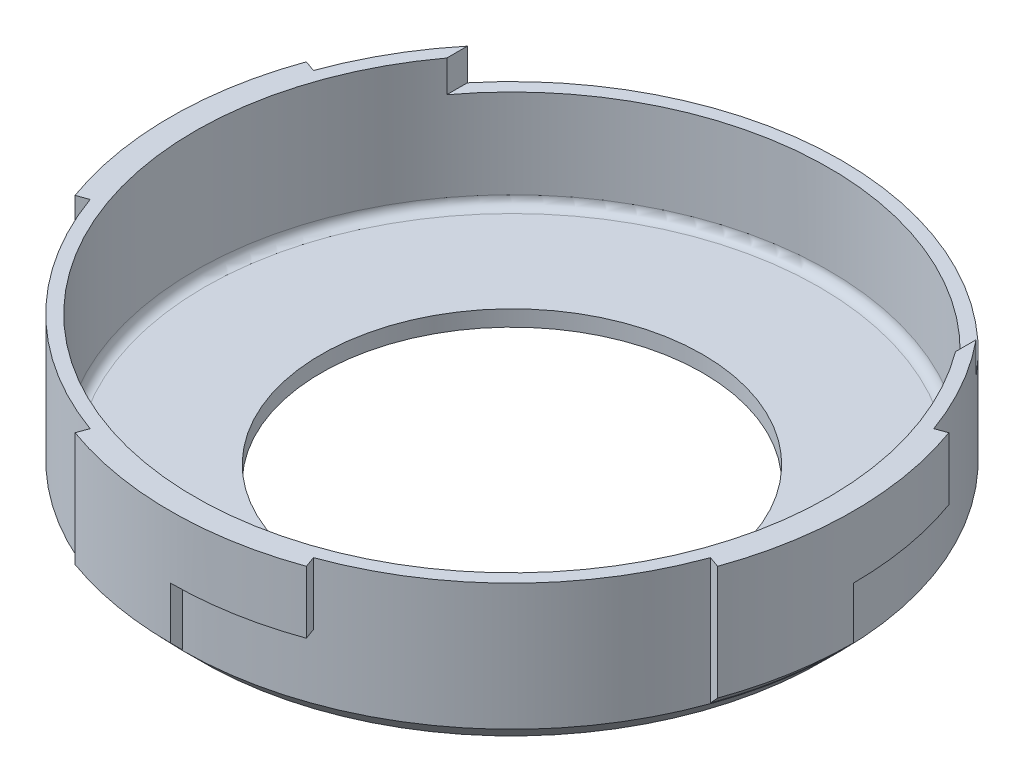
ISO-10303-21;
HEADER;
FILE_DESCRIPTION(('STEP AP214'),'2;1');
FILE_NAME('part.step','',(''),(''),'','','');
FILE_SCHEMA(('AUTOMOTIVE_DESIGN { 1 0 10303 214 1 1 1 1 }'));
ENDSEC;
DATA;
#1=APPLICATION_CONTEXT('core data for automotive mechanical design processes');
#2=APPLICATION_PROTOCOL_DEFINITION('international standard','automotive_design',2000,#1);
#3=PRODUCT_CONTEXT('',#1,'mechanical');
#4=PRODUCT('Part','Part','',(#3));
#5=PRODUCT_RELATED_PRODUCT_CATEGORY('part','',(#4));
#6=PRODUCT_DEFINITION_FORMATION('','',#4);
#7=PRODUCT_DEFINITION_CONTEXT('part definition',#1,'design');
#8=PRODUCT_DEFINITION('design','',#6,#7);
#9=PRODUCT_DEFINITION_SHAPE('','',#8);
#10=(LENGTH_UNIT() NAMED_UNIT(*) SI_UNIT(.MILLI.,.METRE.));
#11=(NAMED_UNIT(*) PLANE_ANGLE_UNIT() SI_UNIT($,.RADIAN.));
#12=(NAMED_UNIT(*) SI_UNIT($,.STERADIAN.) SOLID_ANGLE_UNIT());
#13=UNCERTAINTY_MEASURE_WITH_UNIT(LENGTH_MEASURE(1.E-05),#10,'distance_accuracy_value','');
#14=(GEOMETRIC_REPRESENTATION_CONTEXT(3) GLOBAL_UNCERTAINTY_ASSIGNED_CONTEXT((#13)) GLOBAL_UNIT_ASSIGNED_CONTEXT((#10,
#11,#12)) REPRESENTATION_CONTEXT('',''));
#15=CARTESIAN_POINT('',(0.,0.,0.));
#16=DIRECTION('',(0.,0.,1.));
#17=DIRECTION('',(1.,0.,0.));
#18=AXIS2_PLACEMENT_3D('',#15,#16,#17);
#19=CARTESIAN_POINT('',(0.,2.5,0.));
#20=DIRECTION('',(0.,-1.,0.));
#21=DIRECTION('',(0.,0.,-1.));
#22=AXIS2_PLACEMENT_3D('',#19,#20,#21);
#23=CYLINDRICAL_SURFACE('',#22,30.);
#24=CARTESIAN_POINT('',(0.,-0.5,0.));
#25=DIRECTION('',(0.,-1.,0.));
#26=DIRECTION('',(0.,0.,-1.));
#27=AXIS2_PLACEMENT_3D('',#24,#25,#26);
#28=CIRCLE('',#27,30.);
#29=CARTESIAN_POINT('',(0.,-0.5,-30.));
#30=VERTEX_POINT('',#29);
#31=EDGE_CURVE('E202',#30,#30,#28,.T.);
#32=ORIENTED_EDGE('',*,*,#31,.T.);
#33=EDGE_LOOP('',(#32));
#34=FACE_BOUND('',#33,.T.);
#35=CARTESIAN_POINT('',(0.,2.,0.));
#36=DIRECTION('',(0.,1.,0.));
#37=DIRECTION('',(0.,0.,1.));
#38=AXIS2_PLACEMENT_3D('',#35,#36,#37);
#39=CIRCLE('',#38,30.);
#40=CARTESIAN_POINT('',(0.,2.,30.));
#41=VERTEX_POINT('',#40);
#42=EDGE_CURVE('E349',#41,#41,#39,.T.);
#43=ORIENTED_EDGE('',*,*,#42,.T.);
#44=EDGE_LOOP('',(#43));
#45=FACE_BOUND('',#44,.T.);
#46=ADVANCED_FACE('F41',(#34,#45),#23,.F.);
#47=CARTESIAN_POINT('',(0.,2.5,0.));
#48=DIRECTION('',(0.,-1.,0.));
#49=DIRECTION('',(0.,0.,-1.));
#50=AXIS2_PLACEMENT_3D('',#47,#48,#49);
#51=CYLINDRICAL_SURFACE('',#50,51.85);
#52=CARTESIAN_POINT('',(0.,2.60000000000001,0.));
#53=DIRECTION('',(0.,-1.,0.));
#54=DIRECTION('',(0.,0.,-1.));
#55=AXIS2_PLACEMENT_3D('',#52,#53,#54);
#56=CIRCLE('',#55,51.85);
#57=CARTESIAN_POINT('',(0.,2.60000000000001,-51.85));
#58=VERTEX_POINT('',#57);
#59=EDGE_CURVE('E448',#58,#58,#56,.F.);
#60=ORIENTED_EDGE('',*,*,#59,.T.);
#61=EDGE_LOOP('',(#60));
#62=FACE_BOUND('',#61,.T.);
#63=CARTESIAN_POINT('',(0.,17.5,0.));
#64=DIRECTION('',(0.,-1.,0.));
#65=DIRECTION('',(0.,0.,-1.));
#66=AXIS2_PLACEMENT_3D('',#63,#64,#65);
#67=CIRCLE('',#66,51.85);
#68=CARTESIAN_POINT('',(-40.,17.5,-32.9912488396545));
#69=VERTEX_POINT('',#68);
#70=CARTESIAN_POINT('',(40.,17.5,-32.9912488396544));
#71=VERTEX_POINT('',#70);
#72=EDGE_CURVE('E210',#69,#71,#67,.T.);
#73=ORIENTED_EDGE('',*,*,#72,.T.);
#74=DIRECTION('',(0.,-1.,0.));
#75=VECTOR('',#74,1.);
#76=CARTESIAN_POINT('',(40.,2.49999999999994,-32.9912488396545));
#77=LINE('',#76,#75);
#78=CARTESIAN_POINT('',(40.,22.5,-32.9912488396544));
#79=VERTEX_POINT('',#78);
#80=EDGE_CURVE('E193',#71,#79,#77,.F.);
#81=ORIENTED_EDGE('',*,*,#80,.T.);
#82=CARTESIAN_POINT('',(0.,22.5,0.));
#83=DIRECTION('',(0.,1.,0.));
#84=DIRECTION('',(0.,0.,1.));
#85=AXIS2_PLACEMENT_3D('',#82,#83,#84);
#86=CIRCLE('',#85,51.85);
#87=CARTESIAN_POINT('',(48.7846678702766,22.5,-17.5635611647184));
#88=VERTEX_POINT('',#87);
#89=EDGE_CURVE('E208',#88,#79,#86,.T.);
#90=ORIENTED_EDGE('',*,*,#89,.F.);
#91=DIRECTION('',(0.,-1.,0.));
#92=VECTOR('',#91,1.);
#93=CARTESIAN_POINT('',(48.7846678702766,22.5,-17.5635611647184));
#94=LINE('',#93,#92);
#95=CARTESIAN_POINT('',(48.7846678702766,12.7,-17.5635611647184));
#96=VERTEX_POINT('',#95);
#97=EDGE_CURVE('E257',#88,#96,#94,.T.);
#98=ORIENTED_EDGE('',*,*,#97,.T.);
#99=CARTESIAN_POINT('',(0.,12.7,0.));
#100=DIRECTION('',(0.,-1.,0.));
#101=DIRECTION('',(0.,0.,-1.));
#102=AXIS2_PLACEMENT_3D('',#99,#100,#101);
#103=CIRCLE('',#102,51.85);
#104=CARTESIAN_POINT('',(51.85,12.7,0.));
#105=VERTEX_POINT('',#104);
#106=EDGE_CURVE('E251',#96,#105,#103,.T.);
#107=ORIENTED_EDGE('',*,*,#106,.T.);
#108=DIRECTION('',(0.,-1.,0.));
#109=VECTOR('',#108,1.);
#110=CARTESIAN_POINT('',(51.85,22.5,0.));
#111=LINE('',#110,#109);
#112=CARTESIAN_POINT('',(51.85,2.7,0.));
#113=VERTEX_POINT('',#112);
#114=EDGE_CURVE('E245',#105,#113,#111,.T.);
#115=ORIENTED_EDGE('',*,*,#114,.T.);
#116=CARTESIAN_POINT('',(0.,2.7,0.));
#117=DIRECTION('',(0.,1.,0.));
#118=DIRECTION('',(0.,0.,1.));
#119=AXIS2_PLACEMENT_3D('',#116,#117,#118);
#120=CIRCLE('',#119,51.85);
#121=CARTESIAN_POINT('',(48.7846678702766,2.7,17.5635611647184));
#122=VERTEX_POINT('',#121);
#123=EDGE_CURVE('E229',#122,#113,#120,.T.);
#124=ORIENTED_EDGE('',*,*,#123,.F.);
#125=DIRECTION('',(0.,-1.,0.));
#126=VECTOR('',#125,1.);
#127=CARTESIAN_POINT('',(48.7846678702766,22.5,17.5635611647184));
#128=LINE('',#127,#126);
#129=CARTESIAN_POINT('',(48.7846678702766,22.5,17.5635611647184));
#130=VERTEX_POINT('',#129);
#131=EDGE_CURVE('E241',#130,#122,#128,.T.);
#132=ORIENTED_EDGE('',*,*,#131,.F.);
#133=CARTESIAN_POINT('',(17.5635611647182,22.5,48.7846678702766));
#134=VERTEX_POINT('',#133);
#135=EDGE_CURVE('E220',#134,#130,#86,.T.);
#136=ORIENTED_EDGE('',*,*,#135,.F.);
#137=DIRECTION('',(0.,-1.,0.));
#138=VECTOR('',#137,1.);
#139=CARTESIAN_POINT('',(17.5635611647182,22.5,48.7846678702766));
#140=LINE('',#139,#138);
#141=CARTESIAN_POINT('',(17.5635611647182,12.7,48.7846678702766));
#142=VERTEX_POINT('',#141);
#143=EDGE_CURVE('E308',#134,#142,#140,.T.);
#144=ORIENTED_EDGE('',*,*,#143,.T.);
#145=CARTESIAN_POINT('',(0.,12.7,0.));
#146=DIRECTION('',(0.,-1.,0.));
#147=DIRECTION('',(1.,0.,0.));
#148=AXIS2_PLACEMENT_3D('',#145,#146,#147);
#149=CIRCLE('',#148,51.85);
#150=CARTESIAN_POINT('',(-1.81033307419016E-13,12.7,51.85));
#151=VERTEX_POINT('',#150);
#152=EDGE_CURVE('E302',#142,#151,#149,.T.);
#153=ORIENTED_EDGE('',*,*,#152,.T.);
#154=DIRECTION('',(0.,-1.,0.));
#155=VECTOR('',#154,1.);
#156=CARTESIAN_POINT('',(-1.81033307419016E-13,22.5,51.85));
#157=LINE('',#156,#155);
#158=CARTESIAN_POINT('',(-1.81033307419016E-13,2.7,51.85));
#159=VERTEX_POINT('',#158);
#160=EDGE_CURVE('E280',#151,#159,#157,.T.);
#161=ORIENTED_EDGE('',*,*,#160,.T.);
#162=CARTESIAN_POINT('',(0.,2.7,0.));
#163=DIRECTION('',(0.,1.,0.));
#164=DIRECTION('',(-1.,0.,0.));
#165=AXIS2_PLACEMENT_3D('',#162,#163,#164);
#166=CIRCLE('',#165,51.85);
#167=CARTESIAN_POINT('',(-17.5635611647186,2.7,48.7846678702765));
#168=VERTEX_POINT('',#167);
#169=EDGE_CURVE('E266',#168,#159,#166,.T.);
#170=ORIENTED_EDGE('',*,*,#169,.F.);
#171=DIRECTION('',(0.,-1.,0.));
#172=VECTOR('',#171,1.);
#173=CARTESIAN_POINT('',(-17.5635611647186,22.5,48.7846678702765));
#174=LINE('',#173,#172);
#175=CARTESIAN_POINT('',(-17.5635611647186,22.5,48.7846678702765));
#176=VERTEX_POINT('',#175);
#177=EDGE_CURVE('E276',#176,#168,#174,.T.);
#178=ORIENTED_EDGE('',*,*,#177,.F.);
#179=CARTESIAN_POINT('',(-48.7846678702766,22.5,17.5635611647184));
#180=VERTEX_POINT('',#179);
#181=EDGE_CURVE('E223',#180,#176,#86,.T.);
#182=ORIENTED_EDGE('',*,*,#181,.F.);
#183=DIRECTION('',(0.,-1.,0.));
#184=VECTOR('',#183,1.);
#185=CARTESIAN_POINT('',(-48.7846678702766,22.5,17.5635611647184));
#186=LINE('',#185,#184);
#187=CARTESIAN_POINT('',(-48.7846678702766,12.7,17.5635611647184));
#188=VERTEX_POINT('',#187);
#189=EDGE_CURVE('E328',#180,#188,#186,.T.);
#190=ORIENTED_EDGE('',*,*,#189,.T.);
#191=CARTESIAN_POINT('',(0.,12.7,0.));
#192=DIRECTION('',(0.,-1.,0.));
#193=DIRECTION('',(0.,0.,1.));
#194=AXIS2_PLACEMENT_3D('',#191,#192,#193);
#195=CIRCLE('',#194,51.85);
#196=CARTESIAN_POINT('',(-51.85,12.7,0.));
#197=VERTEX_POINT('',#196);
#198=EDGE_CURVE('E322',#188,#197,#195,.T.);
#199=ORIENTED_EDGE('',*,*,#198,.T.);
#200=DIRECTION('',(0.,-1.,0.));
#201=VECTOR('',#200,1.);
#202=CARTESIAN_POINT('',(-51.85,22.5,0.));
#203=LINE('',#202,#201);
#204=CARTESIAN_POINT('',(-51.85,2.7,0.));
#205=VERTEX_POINT('',#204);
#206=EDGE_CURVE('E296',#197,#205,#203,.T.);
#207=ORIENTED_EDGE('',*,*,#206,.T.);
#208=CARTESIAN_POINT('',(0.,2.7,0.));
#209=DIRECTION('',(0.,1.,0.));
#210=DIRECTION('',(0.,0.,-1.));
#211=AXIS2_PLACEMENT_3D('',#208,#209,#210);
#212=CIRCLE('',#211,51.85);
#213=CARTESIAN_POINT('',(-48.7846678702766,2.7,-17.5635611647184));
#214=VERTEX_POINT('',#213);
#215=EDGE_CURVE('E283',#214,#205,#212,.T.);
#216=ORIENTED_EDGE('',*,*,#215,.F.);
#217=DIRECTION('',(0.,-1.,0.));
#218=VECTOR('',#217,1.);
#219=CARTESIAN_POINT('',(-48.7846678702766,22.5,-17.5635611647184));
#220=LINE('',#219,#218);
#221=CARTESIAN_POINT('',(-48.7846678702766,22.5,-17.5635611647184));
#222=VERTEX_POINT('',#221);
#223=EDGE_CURVE('E292',#222,#214,#220,.T.);
#224=ORIENTED_EDGE('',*,*,#223,.F.);
#225=CARTESIAN_POINT('',(-40.,22.5,-32.9912488396544));
#226=VERTEX_POINT('',#225);
#227=EDGE_CURVE('E218',#226,#222,#86,.T.);
#228=ORIENTED_EDGE('',*,*,#227,.F.);
#229=DIRECTION('',(0.,-1.,0.));
#230=VECTOR('',#229,1.);
#231=CARTESIAN_POINT('',(-40.,2.49999999999994,-32.9912488396545));
#232=LINE('',#231,#230);
#233=EDGE_CURVE('E339',#226,#69,#232,.T.);
#234=ORIENTED_EDGE('',*,*,#233,.T.);
#235=EDGE_LOOP('',(#73,#81,#90,#98,#107,#115,#124,#132,#136,#144,#153,#161,#170,#178,#182,#190,
#199,#207,#216,#224,#228,#234));
#236=FACE_BOUND('',#235,.T.);
#237=ADVANCED_FACE('F206',(#62,#236),#51,.T.);
#238=CARTESIAN_POINT('',(0.,22.5,0.));
#239=DIRECTION('',(0.,1.,0.));
#240=DIRECTION('',(0.,0.,1.));
#241=AXIS2_PLACEMENT_3D('',#238,#239,#240);
#242=PLANE('',#241);
#243=DIRECTION('',(0.,0.,1.));
#244=VECTOR('',#243,1.);
#245=CARTESIAN_POINT('',(40.,22.5,-51.85));
#246=LINE('',#245,#244);
#247=CARTESIAN_POINT('',(40.,22.5,-29.7493277234965));
#248=VERTEX_POINT('',#247);
#249=EDGE_CURVE('E189',#79,#248,#246,.T.);
#250=ORIENTED_EDGE('',*,*,#249,.T.);
#251=CARTESIAN_POINT('',(0.,22.5,0.));
#252=DIRECTION('',(0.,1.,0.));
#253=DIRECTION('',(0.,0.,1.));
#254=AXIS2_PLACEMENT_3D('',#251,#252,#253);
#255=CIRCLE('',#254,49.85);
#256=CARTESIAN_POINT('',(-40.,22.5,-29.7493277234965));
#257=VERTEX_POINT('',#256);
#258=EDGE_CURVE('E225',#257,#248,#255,.T.);
#259=ORIENTED_EDGE('',*,*,#258,.F.);
#260=DIRECTION('',(0.,0.,1.));
#261=VECTOR('',#260,1.);
#262=CARTESIAN_POINT('',(-40.,22.5,-51.85));
#263=LINE('',#262,#261);
#264=EDGE_CURVE('E201',#226,#257,#263,.T.);
#265=ORIENTED_EDGE('',*,*,#264,.F.);
#266=ORIENTED_EDGE('',*,*,#227,.T.);
#267=DIRECTION('',(0.940880768954225,0.,0.338737920245292));
#268=VECTOR('',#267,1.);
#269=CARTESIAN_POINT('',(-48.7846678702766,22.5,-17.5635611647184));
#270=LINE('',#269,#268);
#271=CARTESIAN_POINT('',(-50.5252972928419,22.5,-18.1902263171722));
#272=VERTEX_POINT('',#271);
#273=EDGE_CURVE('E287',#272,#222,#270,.T.);
#274=ORIENTED_EDGE('',*,*,#273,.F.);
#275=CARTESIAN_POINT('',(0.,22.5,0.));
#276=DIRECTION('',(0.,1.,0.));
#277=DIRECTION('',(0.,0.,-1.));
#278=AXIS2_PLACEMENT_3D('',#275,#276,#277);
#279=CIRCLE('',#278,53.7);
#280=CARTESIAN_POINT('',(-50.5252972928419,22.5,18.1902263171722));
#281=VERTEX_POINT('',#280);
#282=EDGE_CURVE('E285',#272,#281,#279,.T.);
#283=ORIENTED_EDGE('',*,*,#282,.T.);
#284=DIRECTION('',(0.940880768954225,0.,-0.338737920245292));
#285=VECTOR('',#284,1.);
#286=CARTESIAN_POINT('',(-50.5252972928419,22.5,18.1902263171722));
#287=LINE('',#286,#285);
#288=EDGE_CURVE('E331',#281,#180,#287,.T.);
#289=ORIENTED_EDGE('',*,*,#288,.T.);
#290=ORIENTED_EDGE('',*,*,#181,.T.);
#291=DIRECTION('',(0.338737920245295,0.,-0.940880768954224));
#292=VECTOR('',#291,1.);
#293=CARTESIAN_POINT('',(-17.5635611647186,22.5,48.7846678702765));
#294=LINE('',#293,#292);
#295=CARTESIAN_POINT('',(-18.1902263171724,22.5,50.5252972928418));
#296=VERTEX_POINT('',#295);
#297=EDGE_CURVE('E271',#296,#176,#294,.T.);
#298=ORIENTED_EDGE('',*,*,#297,.F.);
#299=CARTESIAN_POINT('',(0.,22.5,0.));
#300=DIRECTION('',(0.,1.,0.));
#301=DIRECTION('',(-1.,0.,0.));
#302=AXIS2_PLACEMENT_3D('',#299,#300,#301);
#303=CIRCLE('',#302,53.7);
#304=CARTESIAN_POINT('',(18.190226317172,22.5,50.525297292842));
#305=VERTEX_POINT('',#304);
#306=EDGE_CURVE('E269',#296,#305,#303,.T.);
#307=ORIENTED_EDGE('',*,*,#306,.T.);
#308=DIRECTION('',(-0.338737920245289,0.,-0.940880768954226));
#309=VECTOR('',#308,1.);
#310=CARTESIAN_POINT('',(18.190226317172,22.5,50.525297292842));
#311=LINE('',#310,#309);
#312=EDGE_CURVE('E311',#305,#134,#311,.T.);
#313=ORIENTED_EDGE('',*,*,#312,.T.);
#314=ORIENTED_EDGE('',*,*,#135,.T.);
#315=DIRECTION('',(-0.940880768954225,0.,-0.338737920245292));
#316=VECTOR('',#315,1.);
#317=CARTESIAN_POINT('',(48.7846678702766,22.5,17.5635611647184));
#318=LINE('',#317,#316);
#319=CARTESIAN_POINT('',(50.5252972928419,22.5,18.1902263171722));
#320=VERTEX_POINT('',#319);
#321=EDGE_CURVE('E237',#320,#130,#318,.T.);
#322=ORIENTED_EDGE('',*,*,#321,.F.);
#323=CARTESIAN_POINT('',(0.,22.5,0.));
#324=DIRECTION('',(0.,1.,0.));
#325=DIRECTION('',(0.,0.,1.));
#326=AXIS2_PLACEMENT_3D('',#323,#324,#325);
#327=CIRCLE('',#326,53.7);
#328=CARTESIAN_POINT('',(50.5252972928419,22.5,-18.1902263171722));
#329=VERTEX_POINT('',#328);
#330=EDGE_CURVE('E233',#320,#329,#327,.T.);
#331=ORIENTED_EDGE('',*,*,#330,.T.);
#332=DIRECTION('',(-0.940880768954225,0.,0.338737920245292));
#333=VECTOR('',#332,1.);
#334=CARTESIAN_POINT('',(50.5252972928419,22.5,-18.1902263171722));
#335=LINE('',#334,#333);
#336=EDGE_CURVE('E215',#329,#88,#335,.T.);
#337=ORIENTED_EDGE('',*,*,#336,.T.);
#338=ORIENTED_EDGE('',*,*,#89,.T.);
#339=EDGE_LOOP('',(#250,#259,#265,#266,#274,#283,#289,#290,#298,#307,#313,#314,#322,#331,#337,#338));
#340=FACE_BOUND('',#339,.T.);
#341=ADVANCED_FACE('F213',(#340),#242,.T.);
#342=CARTESIAN_POINT('',(0.,22.5,0.));
#343=DIRECTION('',(0.,-1.,0.));
#344=DIRECTION('',(0.,0.,-1.));
#345=AXIS2_PLACEMENT_3D('',#342,#343,#344);
#346=CYLINDRICAL_SURFACE('',#345,49.85);
#347=CARTESIAN_POINT('',(0.,3.5,0.));
#348=DIRECTION('',(0.,1.,0.));
#349=DIRECTION('',(0.,0.,1.));
#350=AXIS2_PLACEMENT_3D('',#347,#348,#349);
#351=CIRCLE('',#350,49.85);
#352=CARTESIAN_POINT('',(0.,3.5,49.85));
#353=VERTEX_POINT('',#352);
#354=EDGE_CURVE('E442',#353,#353,#351,.F.);
#355=ORIENTED_EDGE('',*,*,#354,.T.);
#356=EDGE_LOOP('',(#355));
#357=FACE_BOUND('',#356,.T.);
#358=DIRECTION('',(0.,-1.,0.));
#359=VECTOR('',#358,1.);
#360=CARTESIAN_POINT('',(40.,22.4999999999999,-29.7493277234965));
#361=LINE('',#360,#359);
#362=CARTESIAN_POINT('',(40.,17.5,-29.7493277234965));
#363=VERTEX_POINT('',#362);
#364=EDGE_CURVE('E196',#363,#248,#361,.F.);
#365=ORIENTED_EDGE('',*,*,#364,.F.);
#366=CARTESIAN_POINT('',(0.,17.5,0.));
#367=DIRECTION('',(0.,-1.,0.));
#368=DIRECTION('',(0.,0.,-1.));
#369=AXIS2_PLACEMENT_3D('',#366,#367,#368);
#370=CIRCLE('',#369,49.85);
#371=CARTESIAN_POINT('',(-40.,17.5,-29.7493277234966));
#372=VERTEX_POINT('',#371);
#373=EDGE_CURVE('E221',#372,#363,#370,.T.);
#374=ORIENTED_EDGE('',*,*,#373,.F.);
#375=DIRECTION('',(0.,-1.,0.));
#376=VECTOR('',#375,1.);
#377=CARTESIAN_POINT('',(-40.,22.4999999999999,-29.7493277234965));
#378=LINE('',#377,#376);
#379=EDGE_CURVE('E217',#257,#372,#378,.T.);
#380=ORIENTED_EDGE('',*,*,#379,.F.);
#381=ORIENTED_EDGE('',*,*,#258,.T.);
#382=EDGE_LOOP('',(#365,#374,#380,#381));
#383=FACE_BOUND('',#382,.T.);
#384=ADVANCED_FACE('F435',(#357,#383),#346,.F.);
#385=CARTESIAN_POINT('',(0.,-6.24919411764113,0.));
#386=DIRECTION('',(0.,1.,0.));
#387=DIRECTION('',(0.,0.,1.));
#388=AXIS2_PLACEMENT_3D('',#385,#386,#387);
#389=CYLINDRICAL_SURFACE('',#388,53.7);
#390=DIRECTION('',(0.,1.,0.));
#391=VECTOR('',#390,1.);
#392=CARTESIAN_POINT('',(50.5252972928419,22.5,18.1902263171722));
#393=LINE('',#392,#391);
#394=CARTESIAN_POINT('',(50.5252972928419,4.55000000000001,18.1902263171722));
#395=VERTEX_POINT('',#394);
#396=EDGE_CURVE('E239',#395,#320,#393,.T.);
#397=ORIENTED_EDGE('',*,*,#396,.F.);
#398=CARTESIAN_POINT('',(0.,4.55,0.));
#399=DIRECTION('',(0.,1.,0.));
#400=DIRECTION('',(0.,0.,1.));
#401=AXIS2_PLACEMENT_3D('',#398,#399,#400);
#402=CIRCLE('',#401,53.7);
#403=CARTESIAN_POINT('',(53.7,4.55000000000001,0.));
#404=VERTEX_POINT('',#403);
#405=EDGE_CURVE('E410',#395,#404,#402,.T.);
#406=ORIENTED_EDGE('',*,*,#405,.T.);
#407=DIRECTION('',(0.,1.,0.));
#408=VECTOR('',#407,1.);
#409=CARTESIAN_POINT('',(53.7,22.5,0.));
#410=LINE('',#409,#408);
#411=CARTESIAN_POINT('',(53.7,12.7,0.));
#412=VERTEX_POINT('',#411);
#413=EDGE_CURVE('E243',#404,#412,#410,.T.);
#414=ORIENTED_EDGE('',*,*,#413,.T.);
#415=CARTESIAN_POINT('',(0.,12.7,0.));
#416=DIRECTION('',(0.,-1.,0.));
#417=DIRECTION('',(0.,0.,-1.));
#418=AXIS2_PLACEMENT_3D('',#415,#416,#417);
#419=CIRCLE('',#418,53.7);
#420=CARTESIAN_POINT('',(50.5252972928419,12.7,-18.1902263171722));
#421=VERTEX_POINT('',#420);
#422=EDGE_CURVE('E248',#421,#412,#419,.T.);
#423=ORIENTED_EDGE('',*,*,#422,.F.);
#424=DIRECTION('',(0.,1.,0.));
#425=VECTOR('',#424,1.);
#426=CARTESIAN_POINT('',(50.5252972928419,22.5,-18.1902263171722));
#427=LINE('',#426,#425);
#428=EDGE_CURVE('E260',#421,#329,#427,.T.);
#429=ORIENTED_EDGE('',*,*,#428,.T.);
#430=ORIENTED_EDGE('',*,*,#330,.F.);
#431=EDGE_LOOP('',(#397,#406,#414,#423,#429,#430));
#432=FACE_BOUND('',#431,.T.);
#433=ADVANCED_FACE('F459',(#432),#389,.T.);
#434=CARTESIAN_POINT('',(0.,0.,0.));
#435=DIRECTION('',(-0.338737920245292,0.,0.940880768954225));
#436=DIRECTION('',(0.940880768954225,0.,0.338737920245292));
#437=AXIS2_PLACEMENT_3D('',#434,#435,#436);
#438=PLANE('',#437);
#439=ORIENTED_EDGE('',*,*,#131,.T.);
#440=DIRECTION('',(0.665303172015548,0.707106781186545,0.239523880450475));
#441=VECTOR('',#440,1.);
#442=CARTESIAN_POINT('',(0.,-49.1499999999996,0.));
#443=LINE('',#442,#441);
#444=EDGE_CURVE('E407',#122,#395,#443,.T.);
#445=ORIENTED_EDGE('',*,*,#444,.T.);
#446=ORIENTED_EDGE('',*,*,#396,.T.);
#447=ORIENTED_EDGE('',*,*,#321,.T.);
#448=EDGE_LOOP('',(#439,#445,#446,#447));
#449=FACE_BOUND('',#448,.T.);
#450=ADVANCED_FACE('F471',(#449),#438,.T.);
#451=CARTESIAN_POINT('',(0.,0.,0.));
#452=DIRECTION('',(0.,0.,1.));
#453=DIRECTION('',(1.,0.,0.));
#454=AXIS2_PLACEMENT_3D('',#451,#452,#453);
#455=PLANE('',#454);
#456=ORIENTED_EDGE('',*,*,#413,.F.);
#457=DIRECTION('',(0.70710678118655,0.707106781186545,0.));
#458=VECTOR('',#457,1.);
#459=CARTESIAN_POINT('',(0.,-49.1499999999996,0.));
#460=LINE('',#459,#458);
#461=EDGE_CURVE('E414',#404,#113,#460,.F.);
#462=ORIENTED_EDGE('',*,*,#461,.T.);
#463=ORIENTED_EDGE('',*,*,#114,.F.);
#464=DIRECTION('',(1.,0.,0.));
#465=VECTOR('',#464,1.);
#466=CARTESIAN_POINT('',(53.7,12.7,0.));
#467=LINE('',#466,#465);
#468=EDGE_CURVE('E263',#105,#412,#467,.T.);
#469=ORIENTED_EDGE('',*,*,#468,.T.);
#470=EDGE_LOOP('',(#456,#462,#463,#469));
#471=FACE_BOUND('',#470,.T.);
#472=ADVANCED_FACE('F462',(#471),#455,.F.);
#473=CARTESIAN_POINT('',(50.5252972928419,12.7,-18.1902263171722));
#474=DIRECTION('',(0.,-1.,0.));
#475=DIRECTION('',(0.,0.,-1.));
#476=AXIS2_PLACEMENT_3D('',#473,#474,#475);
#477=PLANE('',#476);
#478=ORIENTED_EDGE('',*,*,#106,.F.);
#479=DIRECTION('',(0.940880768954225,0.,-0.338737920245292));
#480=VECTOR('',#479,1.);
#481=CARTESIAN_POINT('',(50.5252972928419,12.7,-18.1902263171722));
#482=LINE('',#481,#480);
#483=EDGE_CURVE('E254',#96,#421,#482,.T.);
#484=ORIENTED_EDGE('',*,*,#483,.T.);
#485=ORIENTED_EDGE('',*,*,#422,.T.);
#486=ORIENTED_EDGE('',*,*,#468,.F.);
#487=EDGE_LOOP('',(#478,#484,#485,#486));
#488=FACE_BOUND('',#487,.T.);
#489=ADVANCED_FACE('F465',(#488),#477,.T.);
#490=CARTESIAN_POINT('',(0.,0.,0.));
#491=DIRECTION('',(-0.338737920245292,0.,-0.940880768954225));
#492=DIRECTION('',(-0.940880768954225,0.,0.338737920245292));
#493=AXIS2_PLACEMENT_3D('',#490,#491,#492);
#494=PLANE('',#493);
#495=ORIENTED_EDGE('',*,*,#428,.F.);
#496=ORIENTED_EDGE('',*,*,#483,.F.);
#497=ORIENTED_EDGE('',*,*,#97,.F.);
#498=ORIENTED_EDGE('',*,*,#336,.F.);
#499=EDGE_LOOP('',(#495,#496,#497,#498));
#500=FACE_BOUND('',#499,.T.);
#501=ADVANCED_FACE('F469',(#500),#494,.T.);
#502=CARTESIAN_POINT('',(0.,-6.24919411764113,0.));
#503=DIRECTION('',(0.,1.,0.));
#504=DIRECTION('',(-1.,0.,0.));
#505=AXIS2_PLACEMENT_3D('',#502,#503,#504);
#506=CYLINDRICAL_SURFACE('',#505,53.7);
#507=DIRECTION('',(0.,1.,0.));
#508=VECTOR('',#507,1.);
#509=CARTESIAN_POINT('',(-18.1902263171724,22.5,50.5252972928418));
#510=LINE('',#509,#508);
#511=CARTESIAN_POINT('',(-18.1902263171724,4.54999999999999,50.5252972928418));
#512=VERTEX_POINT('',#511);
#513=EDGE_CURVE('E274',#512,#296,#510,.T.);
#514=ORIENTED_EDGE('',*,*,#513,.F.);
#515=CARTESIAN_POINT('',(0.,4.54999999999998,0.));
#516=DIRECTION('',(0.,1.,0.));
#517=DIRECTION('',(0.,0.,1.));
#518=AXIS2_PLACEMENT_3D('',#515,#516,#517);
#519=CIRCLE('',#518,53.7);
#520=CARTESIAN_POINT('',(-1.87492547895876E-13,4.54999999999999,53.7));
#521=VERTEX_POINT('',#520);
#522=EDGE_CURVE('E451',#512,#521,#519,.T.);
#523=ORIENTED_EDGE('',*,*,#522,.T.);
#524=DIRECTION('',(0.,1.,0.));
#525=VECTOR('',#524,1.);
#526=CARTESIAN_POINT('',(-1.87492547895876E-13,22.5,53.7));
#527=LINE('',#526,#525);
#528=CARTESIAN_POINT('',(-1.87492547895876E-13,12.7,53.7));
#529=VERTEX_POINT('',#528);
#530=EDGE_CURVE('E278',#521,#529,#527,.T.);
#531=ORIENTED_EDGE('',*,*,#530,.T.);
#532=CARTESIAN_POINT('',(0.,12.7,0.));
#533=DIRECTION('',(0.,-1.,0.));
#534=DIRECTION('',(1.,0.,0.));
#535=AXIS2_PLACEMENT_3D('',#532,#533,#534);
#536=CIRCLE('',#535,53.7);
#537=CARTESIAN_POINT('',(18.190226317172,12.7,50.525297292842));
#538=VERTEX_POINT('',#537);
#539=EDGE_CURVE('E299',#538,#529,#536,.T.);
#540=ORIENTED_EDGE('',*,*,#539,.F.);
#541=DIRECTION('',(0.,1.,0.));
#542=VECTOR('',#541,1.);
#543=CARTESIAN_POINT('',(18.190226317172,22.5,50.525297292842));
#544=LINE('',#543,#542);
#545=EDGE_CURVE('E313',#538,#305,#544,.T.);
#546=ORIENTED_EDGE('',*,*,#545,.T.);
#547=ORIENTED_EDGE('',*,*,#306,.F.);
#548=EDGE_LOOP('',(#514,#523,#531,#540,#546,#547));
#549=FACE_BOUND('',#548,.T.);
#550=ADVANCED_FACE('F493',(#549),#506,.T.);
#551=CARTESIAN_POINT('',(0.,0.,0.));
#552=DIRECTION('',(-0.940880768954224,0.,-0.338737920245295));
#553=DIRECTION('',(-0.338737920245295,0.,0.940880768954224));
#554=AXIS2_PLACEMENT_3D('',#551,#552,#553);
#555=PLANE('',#554);
#556=ORIENTED_EDGE('',*,*,#177,.T.);
#557=DIRECTION('',(-0.239523880450477,0.707106781186546,0.665303172015546));
#558=VECTOR('',#557,1.);
#559=CARTESIAN_POINT('',(0.,-49.1499999999998,0.));
#560=LINE('',#559,#558);
#561=EDGE_CURVE('E456',#168,#512,#560,.T.);
#562=ORIENTED_EDGE('',*,*,#561,.T.);
#563=ORIENTED_EDGE('',*,*,#513,.T.);
#564=ORIENTED_EDGE('',*,*,#297,.T.);
#565=EDGE_LOOP('',(#556,#562,#563,#564));
#566=FACE_BOUND('',#565,.T.);
#567=ADVANCED_FACE('F490',(#566),#555,.T.);
#568=CARTESIAN_POINT('',(0.,0.,0.));
#569=DIRECTION('',(-1.,0.,0.));
#570=DIRECTION('',(0.,0.,1.));
#571=AXIS2_PLACEMENT_3D('',#568,#569,#570);
#572=PLANE('',#571);
#573=ORIENTED_EDGE('',*,*,#530,.F.);
#574=DIRECTION('',(0.,0.707106781186546,0.707106781186549));
#575=VECTOR('',#574,1.);
#576=CARTESIAN_POINT('',(0.,-49.1499999999998,0.));
#577=LINE('',#576,#575);
#578=EDGE_CURVE('E454',#521,#159,#577,.F.);
#579=ORIENTED_EDGE('',*,*,#578,.T.);
#580=ORIENTED_EDGE('',*,*,#160,.F.);
#581=DIRECTION('',(0.,0.,1.));
#582=VECTOR('',#581,1.);
#583=CARTESIAN_POINT('',(-1.87492547895876E-13,12.7,53.7));
#584=LINE('',#583,#582);
#585=EDGE_CURVE('E316',#151,#529,#584,.T.);
#586=ORIENTED_EDGE('',*,*,#585,.T.);
#587=EDGE_LOOP('',(#573,#579,#580,#586));
#588=FACE_BOUND('',#587,.T.);
#589=ADVANCED_FACE('F483',(#588),#572,.F.);
#590=CARTESIAN_POINT('',(0.,-6.24919411764113,0.));
#591=DIRECTION('',(0.,1.,0.));
#592=DIRECTION('',(0.,0.,-1.));
#593=AXIS2_PLACEMENT_3D('',#590,#591,#592);
#594=CYLINDRICAL_SURFACE('',#593,53.7);
#595=DIRECTION('',(0.,1.,0.));
#596=VECTOR('',#595,1.);
#597=CARTESIAN_POINT('',(-50.5252972928419,22.5,-18.1902263171722));
#598=LINE('',#597,#596);
#599=CARTESIAN_POINT('',(-50.5252972928419,4.55000000000001,-18.1902263171722));
#600=VERTEX_POINT('',#599);
#601=EDGE_CURVE('E290',#600,#272,#598,.T.);
#602=ORIENTED_EDGE('',*,*,#601,.F.);
#603=CARTESIAN_POINT('',(0.,4.55,0.));
#604=DIRECTION('',(0.,1.,0.));
#605=DIRECTION('',(0.,0.,1.));
#606=AXIS2_PLACEMENT_3D('',#603,#604,#605);
#607=CIRCLE('',#606,53.7);
#608=CARTESIAN_POINT('',(-53.7,4.55000000000001,0.));
#609=VERTEX_POINT('',#608);
#610=EDGE_CURVE('E413',#600,#609,#607,.T.);
#611=ORIENTED_EDGE('',*,*,#610,.T.);
#612=DIRECTION('',(0.,1.,0.));
#613=VECTOR('',#612,1.);
#614=CARTESIAN_POINT('',(-53.7,22.5,0.));
#615=LINE('',#614,#613);
#616=CARTESIAN_POINT('',(-53.7,12.7,0.));
#617=VERTEX_POINT('',#616);
#618=EDGE_CURVE('E294',#609,#617,#615,.T.);
#619=ORIENTED_EDGE('',*,*,#618,.T.);
#620=CARTESIAN_POINT('',(0.,12.7,0.));
#621=DIRECTION('',(0.,-1.,0.));
#622=DIRECTION('',(0.,0.,1.));
#623=AXIS2_PLACEMENT_3D('',#620,#621,#622);
#624=CIRCLE('',#623,53.7);
#625=CARTESIAN_POINT('',(-50.5252972928419,12.7,18.1902263171722));
#626=VERTEX_POINT('',#625);
#627=EDGE_CURVE('E319',#626,#617,#624,.T.);
#628=ORIENTED_EDGE('',*,*,#627,.F.);
#629=DIRECTION('',(0.,1.,0.));
#630=VECTOR('',#629,1.);
#631=CARTESIAN_POINT('',(-50.5252972928419,22.5,18.1902263171722));
#632=LINE('',#631,#630);
#633=EDGE_CURVE('E333',#626,#281,#632,.T.);
#634=ORIENTED_EDGE('',*,*,#633,.T.);
#635=ORIENTED_EDGE('',*,*,#282,.F.);
#636=EDGE_LOOP('',(#602,#611,#619,#628,#634,#635));
#637=FACE_BOUND('',#636,.T.);
#638=ADVANCED_FACE('F426',(#637),#594,.T.);
#639=CARTESIAN_POINT('',(0.,0.,0.));
#640=DIRECTION('',(0.338737920245292,0.,-0.940880768954225));
#641=DIRECTION('',(-0.940880768954225,0.,-0.338737920245292));
#642=AXIS2_PLACEMENT_3D('',#639,#640,#641);
#643=PLANE('',#642);
#644=ORIENTED_EDGE('',*,*,#223,.T.);
#645=DIRECTION('',(-0.665303172015548,0.707106781186545,-0.239523880450475));
#646=VECTOR('',#645,1.);
#647=CARTESIAN_POINT('',(0.,-49.1499999999996,0.));
#648=LINE('',#647,#646);
#649=EDGE_CURVE('E11',#214,#600,#648,.T.);
#650=ORIENTED_EDGE('',*,*,#649,.T.);
#651=ORIENTED_EDGE('',*,*,#601,.T.);
#652=ORIENTED_EDGE('',*,*,#273,.T.);
#653=EDGE_LOOP('',(#644,#650,#651,#652));
#654=FACE_BOUND('',#653,.T.);
#655=ADVANCED_FACE('F429',(#654),#643,.T.);
#656=CARTESIAN_POINT('',(0.,0.,0.));
#657=DIRECTION('',(0.,0.,-1.));
#658=DIRECTION('',(-1.,0.,0.));
#659=AXIS2_PLACEMENT_3D('',#656,#657,#658);
#660=PLANE('',#659);
#661=ORIENTED_EDGE('',*,*,#618,.F.);
#662=DIRECTION('',(-0.70710678118655,0.707106781186545,0.));
#663=VECTOR('',#662,1.);
#664=CARTESIAN_POINT('',(0.,-49.1499999999996,0.));
#665=LINE('',#664,#663);
#666=EDGE_CURVE('E50',#609,#205,#665,.F.);
#667=ORIENTED_EDGE('',*,*,#666,.T.);
#668=ORIENTED_EDGE('',*,*,#206,.F.);
#669=DIRECTION('',(-1.,0.,0.));
#670=VECTOR('',#669,1.);
#671=CARTESIAN_POINT('',(-53.7,12.7,0.));
#672=LINE('',#671,#670);
#673=EDGE_CURVE('E211',#197,#617,#672,.T.);
#674=ORIENTED_EDGE('',*,*,#673,.T.);
#675=EDGE_LOOP('',(#661,#667,#668,#674));
#676=FACE_BOUND('',#675,.T.);
#677=ADVANCED_FACE('F422',(#676),#660,.F.);
#678=CARTESIAN_POINT('',(18.190226317172,12.7,50.525297292842));
#679=DIRECTION('',(0.,-1.,0.));
#680=DIRECTION('',(1.,0.,0.));
#681=AXIS2_PLACEMENT_3D('',#678,#679,#680);
#682=PLANE('',#681);
#683=ORIENTED_EDGE('',*,*,#152,.F.);
#684=DIRECTION('',(0.338737920245289,0.,0.940880768954226));
#685=VECTOR('',#684,1.);
#686=CARTESIAN_POINT('',(18.190226317172,12.7,50.525297292842));
#687=LINE('',#686,#685);
#688=EDGE_CURVE('E305',#142,#538,#687,.T.);
#689=ORIENTED_EDGE('',*,*,#688,.T.);
#690=ORIENTED_EDGE('',*,*,#539,.T.);
#691=ORIENTED_EDGE('',*,*,#585,.F.);
#692=EDGE_LOOP('',(#683,#689,#690,#691));
#693=FACE_BOUND('',#692,.T.);
#694=ADVANCED_FACE('F480',(#693),#682,.T.);
#695=CARTESIAN_POINT('',(0.,0.,0.));
#696=DIRECTION('',(0.940880768954226,0.,-0.338737920245289));
#697=DIRECTION('',(-0.338737920245289,0.,-0.940880768954226));
#698=AXIS2_PLACEMENT_3D('',#695,#696,#697);
#699=PLANE('',#698);
#700=ORIENTED_EDGE('',*,*,#545,.F.);
#701=ORIENTED_EDGE('',*,*,#688,.F.);
#702=ORIENTED_EDGE('',*,*,#143,.F.);
#703=ORIENTED_EDGE('',*,*,#312,.F.);
#704=EDGE_LOOP('',(#700,#701,#702,#703));
#705=FACE_BOUND('',#704,.T.);
#706=ADVANCED_FACE('F478',(#705),#699,.T.);
#707=CARTESIAN_POINT('',(-50.5252972928419,12.7,18.1902263171722));
#708=DIRECTION('',(0.,-1.,0.));
#709=DIRECTION('',(0.,0.,1.));
#710=AXIS2_PLACEMENT_3D('',#707,#708,#709);
#711=PLANE('',#710);
#712=ORIENTED_EDGE('',*,*,#198,.F.);
#713=DIRECTION('',(-0.940880768954225,0.,0.338737920245292));
#714=VECTOR('',#713,1.);
#715=CARTESIAN_POINT('',(-50.5252972928419,12.7,18.1902263171722));
#716=LINE('',#715,#714);
#717=EDGE_CURVE('E325',#188,#626,#716,.T.);
#718=ORIENTED_EDGE('',*,*,#717,.T.);
#719=ORIENTED_EDGE('',*,*,#627,.T.);
#720=ORIENTED_EDGE('',*,*,#673,.F.);
#721=EDGE_LOOP('',(#712,#718,#719,#720));
#722=FACE_BOUND('',#721,.T.);
#723=ADVANCED_FACE('F503',(#722),#711,.T.);
#724=CARTESIAN_POINT('',(0.,0.,0.));
#725=DIRECTION('',(0.338737920245292,0.,0.940880768954225));
#726=DIRECTION('',(0.940880768954225,0.,-0.338737920245292));
#727=AXIS2_PLACEMENT_3D('',#724,#725,#726);
#728=PLANE('',#727);
#729=ORIENTED_EDGE('',*,*,#633,.F.);
#730=ORIENTED_EDGE('',*,*,#717,.F.);
#731=ORIENTED_EDGE('',*,*,#189,.F.);
#732=ORIENTED_EDGE('',*,*,#288,.F.);
#733=EDGE_LOOP('',(#729,#730,#731,#732));
#734=FACE_BOUND('',#733,.T.);
#735=ADVANCED_FACE('F501',(#734),#728,.T.);
#736=CARTESIAN_POINT('',(40.,22.5,-51.85));
#737=DIRECTION('',(1.,0.,0.));
#738=DIRECTION('',(0.,1.,0.));
#739=AXIS2_PLACEMENT_3D('',#736,#737,#738);
#740=PLANE('',#739);
#741=DIRECTION('',(0.,0.,1.));
#742=VECTOR('',#741,1.);
#743=CARTESIAN_POINT('',(40.,17.5,-51.85));
#744=LINE('',#743,#742);
#745=EDGE_CURVE('E340',#71,#363,#744,.T.);
#746=ORIENTED_EDGE('',*,*,#745,.T.);
#747=ORIENTED_EDGE('',*,*,#364,.T.);
#748=ORIENTED_EDGE('',*,*,#249,.F.);
#749=ORIENTED_EDGE('',*,*,#80,.F.);
#750=EDGE_LOOP('',(#746,#747,#748,#749));
#751=FACE_BOUND('',#750,.T.);
#752=ADVANCED_FACE('F192',(#751),#740,.F.);
#753=CARTESIAN_POINT('',(40.,17.5,-51.85));
#754=DIRECTION('',(0.,-1.,0.));
#755=DIRECTION('',(0.,0.,-1.));
#756=AXIS2_PLACEMENT_3D('',#753,#754,#755);
#757=PLANE('',#756);
#758=ORIENTED_EDGE('',*,*,#72,.F.);
#759=DIRECTION('',(0.,0.,1.));
#760=VECTOR('',#759,1.);
#761=CARTESIAN_POINT('',(-40.,17.5,-51.85));
#762=LINE('',#761,#760);
#763=EDGE_CURVE('E343',#69,#372,#762,.T.);
#764=ORIENTED_EDGE('',*,*,#763,.T.);
#765=ORIENTED_EDGE('',*,*,#373,.T.);
#766=ORIENTED_EDGE('',*,*,#745,.F.);
#767=EDGE_LOOP('',(#758,#764,#765,#766));
#768=FACE_BOUND('',#767,.T.);
#769=ADVANCED_FACE('F556',(#768),#757,.F.);
#770=CARTESIAN_POINT('',(-40.,22.5,-51.85));
#771=DIRECTION('',(-1.,0.,0.));
#772=DIRECTION('',(0.,-1.,0.));
#773=AXIS2_PLACEMENT_3D('',#770,#771,#772);
#774=PLANE('',#773);
#775=ORIENTED_EDGE('',*,*,#264,.T.);
#776=ORIENTED_EDGE('',*,*,#379,.T.);
#777=ORIENTED_EDGE('',*,*,#763,.F.);
#778=ORIENTED_EDGE('',*,*,#233,.F.);
#779=EDGE_LOOP('',(#775,#776,#777,#778));
#780=FACE_BOUND('',#779,.T.);
#781=ADVANCED_FACE('F368',(#780),#774,.F.);
#782=CARTESIAN_POINT('',(0.,-0.5,0.));
#783=DIRECTION('',(0.,-1.,0.));
#784=DIRECTION('',(0.,0.,-1.));
#785=AXIS2_PLACEMENT_3D('',#782,#783,#784);
#786=PLANE('',#785);
#787=CARTESIAN_POINT('',(0.,-0.5,0.));
#788=DIRECTION('',(0.,-1.,0.));
#789=DIRECTION('',(0.,0.,-1.));
#790=AXIS2_PLACEMENT_3D('',#787,#788,#789);
#791=CIRCLE('',#790,48.75);
#792=CARTESIAN_POINT('',(0.,-0.5,-48.75));
#793=VERTEX_POINT('',#792);
#794=EDGE_CURVE('E445',#793,#793,#791,.T.);
#795=ORIENTED_EDGE('',*,*,#794,.T.);
#796=EDGE_LOOP('',(#795));
#797=FACE_BOUND('',#796,.T.);
#798=ORIENTED_EDGE('',*,*,#31,.F.);
#799=EDGE_LOOP('',(#798));
#800=FACE_BOUND('',#799,.T.);
#801=ADVANCED_FACE('F357',(#797,#800),#786,.T.);
#802=CARTESIAN_POINT('',(0.,2.,0.));
#803=DIRECTION('',(0.,1.,0.));
#804=DIRECTION('',(0.,0.,1.));
#805=AXIS2_PLACEMENT_3D('',#802,#803,#804);
#806=PLANE('',#805);
#807=CARTESIAN_POINT('',(0.,2.,0.));
#808=DIRECTION('',(0.,1.,0.));
#809=DIRECTION('',(0.,0.,1.));
#810=AXIS2_PLACEMENT_3D('',#807,#808,#809);
#811=CIRCLE('',#810,48.35);
#812=CARTESIAN_POINT('',(0.,2.,48.35));
#813=VERTEX_POINT('',#812);
#814=EDGE_CURVE('E438',#813,#813,#811,.T.);
#815=ORIENTED_EDGE('',*,*,#814,.T.);
#816=EDGE_LOOP('',(#815));
#817=FACE_BOUND('',#816,.T.);
#818=ORIENTED_EDGE('',*,*,#42,.F.);
#819=EDGE_LOOP('',(#818));
#820=FACE_BOUND('',#819,.T.);
#821=ADVANCED_FACE('F354',(#817,#820),#806,.T.);
#822=CARTESIAN_POINT('',(0.,3.5,0.));
#823=DIRECTION('',(0.,1.,0.));
#824=DIRECTION('',(0.,0.,1.));
#825=AXIS2_PLACEMENT_3D('',#822,#823,#824);
#826=TOROIDAL_SURFACE('',#825,48.35,1.5);
#827=ORIENTED_EDGE('',*,*,#354,.F.);
#828=EDGE_LOOP('',(#827));
#829=FACE_BOUND('',#828,.T.);
#830=ORIENTED_EDGE('',*,*,#814,.F.);
#831=EDGE_LOOP('',(#830));
#832=FACE_BOUND('',#831,.T.);
#833=ADVANCED_FACE('F356',(#829,#832),#826,.F.);
#834=CARTESIAN_POINT('',(0.,-0.5,0.));
#835=DIRECTION('',(0.,1.,0.));
#836=DIRECTION('',(0.,0.,1.));
#837=AXIS2_PLACEMENT_3D('',#834,#835,#836);
#838=CONICAL_SURFACE('',#837,48.75,0.785398163397445);
#839=ORIENTED_EDGE('',*,*,#59,.F.);
#840=EDGE_LOOP('',(#839));
#841=FACE_BOUND('',#840,.T.);
#842=ORIENTED_EDGE('',*,*,#794,.F.);
#843=EDGE_LOOP('',(#842));
#844=FACE_BOUND('',#843,.T.);
#845=ADVANCED_FACE('F364',(#841,#844),#838,.T.);
#846=CARTESIAN_POINT('',(0.,4.54999999999998,0.));
#847=DIRECTION('',(0.,1.,0.));
#848=DIRECTION('',(0.,0.,1.));
#849=AXIS2_PLACEMENT_3D('',#846,#847,#848);
#850=CONICAL_SURFACE('',#849,53.7,0.78539816339745);
#851=ORIENTED_EDGE('',*,*,#561,.F.);
#852=ORIENTED_EDGE('',*,*,#169,.T.);
#853=ORIENTED_EDGE('',*,*,#578,.F.);
#854=ORIENTED_EDGE('',*,*,#522,.F.);
#855=EDGE_LOOP('',(#851,#852,#853,#854));
#856=FACE_BOUND('',#855,.T.);
#857=ADVANCED_FACE('F390',(#856),#850,.T.);
#858=CARTESIAN_POINT('',(0.,4.55,0.));
#859=DIRECTION('',(0.,1.,0.));
#860=DIRECTION('',(0.,0.,1.));
#861=AXIS2_PLACEMENT_3D('',#858,#859,#860);
#862=CONICAL_SURFACE('',#861,53.7,0.785398163397452);
#863=ORIENTED_EDGE('',*,*,#444,.F.);
#864=ORIENTED_EDGE('',*,*,#123,.T.);
#865=ORIENTED_EDGE('',*,*,#461,.F.);
#866=ORIENTED_EDGE('',*,*,#405,.F.);
#867=EDGE_LOOP('',(#863,#864,#865,#866));
#868=FACE_BOUND('',#867,.T.);
#869=ADVANCED_FACE('F396',(#868),#862,.T.);
#870=CARTESIAN_POINT('',(0.,4.55,0.));
#871=DIRECTION('',(0.,1.,0.));
#872=DIRECTION('',(0.,0.,1.));
#873=AXIS2_PLACEMENT_3D('',#870,#871,#872);
#874=CONICAL_SURFACE('',#873,53.7,0.785398163397452);
#875=ORIENTED_EDGE('',*,*,#649,.F.);
#876=ORIENTED_EDGE('',*,*,#215,.T.);
#877=ORIENTED_EDGE('',*,*,#666,.F.);
#878=ORIENTED_EDGE('',*,*,#610,.F.);
#879=EDGE_LOOP('',(#875,#876,#877,#878));
#880=FACE_BOUND('',#879,.T.);
#881=ADVANCED_FACE('F44',(#880),#874,.T.);
#882=CLOSED_SHELL('',(#46,#237,#341,#384,#433,#450,#472,#489,#501,#550,#567,#589,#638,#655,#677,
#694,#706,#723,#735,#752,#769,#781,#801,#821,#833,#845,#857,#869,#881));
#883=MANIFOLD_SOLID_BREP('B2',#882);
#884=ADVANCED_BREP_SHAPE_REPRESENTATION('',(#18,#883),#14);
#885=SHAPE_DEFINITION_REPRESENTATION(#9,#884);
ENDSEC;
END-ISO-10303-21;
